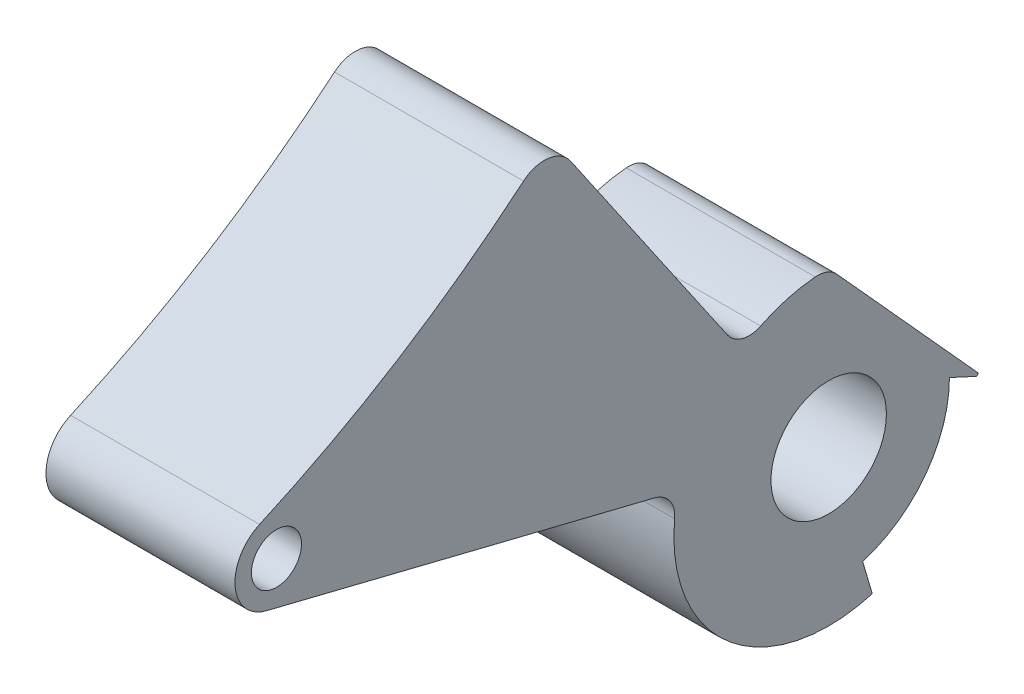
ISO-10303-21;
HEADER;
FILE_DESCRIPTION(('STEP AP214'),'2;1');
FILE_NAME('part.step','',(''),(''),'','','');
FILE_SCHEMA(('AUTOMOTIVE_DESIGN { 1 0 10303 214 1 1 1 1 }'));
ENDSEC;
DATA;
#1=APPLICATION_CONTEXT('core data for automotive mechanical design processes');
#2=APPLICATION_PROTOCOL_DEFINITION('international standard','automotive_design',2000,#1);
#3=PRODUCT_CONTEXT('',#1,'mechanical');
#4=PRODUCT('Part','Part','',(#3));
#5=PRODUCT_RELATED_PRODUCT_CATEGORY('part','',(#4));
#6=PRODUCT_DEFINITION_FORMATION('','',#4);
#7=PRODUCT_DEFINITION_CONTEXT('part definition',#1,'design');
#8=PRODUCT_DEFINITION('design','',#6,#7);
#9=PRODUCT_DEFINITION_SHAPE('','',#8);
#10=(LENGTH_UNIT() NAMED_UNIT(*) SI_UNIT(.MILLI.,.METRE.));
#11=(NAMED_UNIT(*) PLANE_ANGLE_UNIT() SI_UNIT($,.RADIAN.));
#12=(NAMED_UNIT(*) SI_UNIT($,.STERADIAN.) SOLID_ANGLE_UNIT());
#13=UNCERTAINTY_MEASURE_WITH_UNIT(LENGTH_MEASURE(1.E-05),#10,'distance_accuracy_value','');
#14=(GEOMETRIC_REPRESENTATION_CONTEXT(3) GLOBAL_UNCERTAINTY_ASSIGNED_CONTEXT((#13)) GLOBAL_UNIT_ASSIGNED_CONTEXT((#10,
#11,#12)) REPRESENTATION_CONTEXT('',''));
#15=CARTESIAN_POINT('',(0.,0.,0.));
#16=DIRECTION('',(0.,0.,1.));
#17=DIRECTION('',(1.,0.,0.));
#18=AXIS2_PLACEMENT_3D('',#15,#16,#17);
#19=CARTESIAN_POINT('',(9.144,59.6437300638257,49.4078256887024));
#20=DIRECTION('',(-1.,0.,0.));
#21=DIRECTION('',(0.,0.,1.));
#22=AXIS2_PLACEMENT_3D('',#19,#20,#21);
#23=CYLINDRICAL_SURFACE('',#22,53.7538724969782);
#24=CARTESIAN_POINT('',(0.,59.6437300638257,49.4078256887024));
#25=DIRECTION('',(1.,0.,0.));
#26=DIRECTION('',(0.,0.,-1.));
#27=AXIS2_PLACEMENT_3D('',#24,#25,#26);
#28=CIRCLE('',#27,53.7538724969782);
#29=CARTESIAN_POINT('',(0.,10.5384242082329,27.5412359854573));
#30=VERTEX_POINT('',#29);
#31=CARTESIAN_POINT('',(0.,18.5388393420938,14.7687326408775));
#32=VERTEX_POINT('',#31);
#33=EDGE_CURVE('E145',#30,#32,#28,.T.);
#34=ORIENTED_EDGE('',*,*,#33,.F.);
#35=DIRECTION('',(-1.,0.,0.));
#36=VECTOR('',#35,1.);
#37=CARTESIAN_POINT('',(9.144,10.5384242082329,27.5412359854573));
#38=LINE('',#37,#36);
#39=CARTESIAN_POINT('',(9.144,10.5384242082329,27.5412359854573));
#40=VERTEX_POINT('',#39);
#41=EDGE_CURVE('E141',#40,#30,#38,.T.);
#42=ORIENTED_EDGE('',*,*,#41,.F.);
#43=CARTESIAN_POINT('',(9.144,59.6437300638257,49.4078256887024));
#44=DIRECTION('',(1.,0.,0.));
#45=DIRECTION('',(0.,0.,-1.));
#46=AXIS2_PLACEMENT_3D('',#43,#44,#45);
#47=CIRCLE('',#46,53.7538724969782);
#48=CARTESIAN_POINT('',(9.144,18.5388393420938,14.7687326408775));
#49=VERTEX_POINT('',#48);
#50=EDGE_CURVE('E143',#40,#49,#47,.T.);
#51=ORIENTED_EDGE('',*,*,#50,.T.);
#52=DIRECTION('',(-1.,0.,0.));
#53=VECTOR('',#52,1.);
#54=CARTESIAN_POINT('',(9.144,18.5388393420938,14.7687326408775));
#55=LINE('',#54,#53);
#56=EDGE_CURVE('E190',#49,#32,#55,.T.);
#57=ORIENTED_EDGE('',*,*,#56,.T.);
#58=EDGE_LOOP('',(#34,#42,#51,#57));
#59=FACE_BOUND('',#58,.T.);
#60=ADVANCED_FACE('F34',(#59),#23,.F.);
#61=CARTESIAN_POINT('',(9.144,8.7022656556347,26.7235946939466));
#62=DIRECTION('',(-1.,0.,0.));
#63=DIRECTION('',(0.,0.,1.));
#64=AXIS2_PLACEMENT_3D('',#61,#62,#63);
#65=CYLINDRICAL_SURFACE('',#64,2.00997898294054);
#66=CARTESIAN_POINT('',(0.,8.7022656556347,26.7235946939466));
#67=DIRECTION('',(1.,0.,0.));
#68=DIRECTION('',(0.,0.,-1.));
#69=AXIS2_PLACEMENT_3D('',#66,#67,#68);
#70=CIRCLE('',#69,2.00997898294054);
#71=CARTESIAN_POINT('',(0.,6.75145114588074,27.2076796662356));
#72=VERTEX_POINT('',#71);
#73=EDGE_CURVE('E195',#72,#30,#70,.F.);
#74=ORIENTED_EDGE('',*,*,#73,.F.);
#75=DIRECTION('',(-1.,0.,0.));
#76=VECTOR('',#75,1.);
#77=CARTESIAN_POINT('',(9.144,6.75145114588074,27.2076796662356));
#78=LINE('',#77,#76);
#79=CARTESIAN_POINT('',(9.144,6.75145114588074,27.2076796662356));
#80=VERTEX_POINT('',#79);
#81=EDGE_CURVE('E151',#80,#72,#78,.T.);
#82=ORIENTED_EDGE('',*,*,#81,.F.);
#83=CARTESIAN_POINT('',(9.144,8.7022656556347,26.7235946939466));
#84=DIRECTION('',(1.,0.,0.));
#85=DIRECTION('',(0.,0.,-1.));
#86=AXIS2_PLACEMENT_3D('',#83,#84,#85);
#87=CIRCLE('',#86,2.00997898294054);
#88=EDGE_CURVE('E158',#80,#40,#87,.F.);
#89=ORIENTED_EDGE('',*,*,#88,.T.);
#90=ORIENTED_EDGE('',*,*,#41,.T.);
#91=EDGE_LOOP('',(#74,#82,#89,#90));
#92=FACE_BOUND('',#91,.T.);
#93=ADVANCED_FACE('F164',(#92),#65,.T.);
#94=CARTESIAN_POINT('',(9.144,0.,0.));
#95=DIRECTION('',(0.,0.970564630929612,-0.240840812962558));
#96=DIRECTION('',(0.,0.240840812962558,0.970564630929612));
#97=AXIS2_PLACEMENT_3D('',#94,#95,#96);
#98=PLANE('',#97);
#99=DIRECTION('',(0.,-0.240840812962558,-0.970564630929612));
#100=VECTOR('',#99,1.);
#101=CARTESIAN_POINT('',(0.,0.,0.));
#102=LINE('',#101,#100);
#103=CARTESIAN_POINT('',(0.,2.08820608487123,8.41526377168932));
#104=VERTEX_POINT('',#103);
#105=EDGE_CURVE('E197',#72,#104,#102,.T.);
#106=ORIENTED_EDGE('',*,*,#105,.T.);
#107=DIRECTION('',(1.,0.,0.));
#108=VECTOR('',#107,1.);
#109=CARTESIAN_POINT('',(9.144,2.08820608487123,8.41526377168932));
#110=LINE('',#109,#108);
#111=CARTESIAN_POINT('',(9.144,2.08820608487123,8.41526377168932));
#112=VERTEX_POINT('',#111);
#113=EDGE_CURVE('E49',#104,#112,#110,.T.);
#114=ORIENTED_EDGE('',*,*,#113,.T.);
#115=DIRECTION('',(0.,-0.240840812962558,-0.970564630929612));
#116=VECTOR('',#115,1.);
#117=CARTESIAN_POINT('',(9.144,0.,0.));
#118=LINE('',#117,#116);
#119=EDGE_CURVE('E165',#80,#112,#118,.T.);
#120=ORIENTED_EDGE('',*,*,#119,.F.);
#121=ORIENTED_EDGE('',*,*,#81,.T.);
#122=EDGE_LOOP('',(#106,#114,#120,#121));
#123=FACE_BOUND('',#122,.T.);
#124=ADVANCED_FACE('F295',(#123),#98,.F.);
#125=CARTESIAN_POINT('',(9.144,0.,0.));
#126=DIRECTION('',(-1.,0.,0.));
#127=DIRECTION('',(0.,0.,1.));
#128=AXIS2_PLACEMENT_3D('',#125,#126,#127);
#129=CYLINDRICAL_SURFACE('',#128,7.493);
#130=CARTESIAN_POINT('',(9.144,0.,0.));
#131=DIRECTION('',(1.,0.,0.));
#132=DIRECTION('',(0.,0.,-1.));
#133=AXIS2_PLACEMENT_3D('',#130,#131,#132);
#134=CIRCLE('',#133,7.493);
#135=CARTESIAN_POINT('',(9.144,0.731590597273144,7.45719948760803));
#136=VERTEX_POINT('',#135);
#137=CARTESIAN_POINT('',(9.144,-7.19071952423731,-2.10679892817335));
#138=VERTEX_POINT('',#137);
#139=EDGE_CURVE('E167',#136,#138,#134,.T.);
#140=ORIENTED_EDGE('',*,*,#139,.F.);
#141=DIRECTION('',(-1.,0.,0.));
#142=VECTOR('',#141,1.);
#143=CARTESIAN_POINT('',(9.144,0.731590597273144,7.45719948760803));
#144=LINE('',#143,#142);
#145=CARTESIAN_POINT('',(0.,0.731590597273144,7.45719948760803));
#146=VERTEX_POINT('',#145);
#147=EDGE_CURVE('E263',#136,#146,#144,.T.);
#148=ORIENTED_EDGE('',*,*,#147,.T.);
#149=CARTESIAN_POINT('',(0.,0.,0.));
#150=DIRECTION('',(1.,0.,0.));
#151=DIRECTION('',(0.,0.,-1.));
#152=AXIS2_PLACEMENT_3D('',#149,#150,#151);
#153=CIRCLE('',#152,7.493);
#154=CARTESIAN_POINT('',(0.,-7.19071952423731,-2.10679892817335));
#155=VERTEX_POINT('',#154);
#156=EDGE_CURVE('E199',#146,#155,#153,.T.);
#157=ORIENTED_EDGE('',*,*,#156,.T.);
#158=DIRECTION('',(-1.,0.,0.));
#159=VECTOR('',#158,1.);
#160=CARTESIAN_POINT('',(9.144,-7.19071952423731,-2.10679892817335));
#161=LINE('',#160,#159);
#162=EDGE_CURVE('E231',#138,#155,#161,.T.);
#163=ORIENTED_EDGE('',*,*,#162,.F.);
#164=EDGE_LOOP('',(#140,#148,#157,#163));
#165=FACE_BOUND('',#164,.T.);
#166=ADVANCED_FACE('F269',(#165),#129,.T.);
#167=CARTESIAN_POINT('',(9.144,0.,0.));
#168=DIRECTION('',(0.,0.281168948108014,-0.959658284296985));
#169=DIRECTION('',(0.,0.959658284296985,0.281168948108014));
#170=AXIS2_PLACEMENT_3D('',#167,#168,#169);
#171=PLANE('',#170);
#172=DIRECTION('',(0.,-0.959658284296985,-0.281168948108014));
#173=VECTOR('',#172,1.);
#174=CARTESIAN_POINT('',(0.,0.,0.));
#175=LINE('',#174,#173);
#176=CARTESIAN_POINT('',(0.,-5.60632369686299,-1.64258899484702));
#177=VERTEX_POINT('',#176);
#178=EDGE_CURVE('E201',#177,#155,#175,.T.);
#179=ORIENTED_EDGE('',*,*,#178,.F.);
#180=DIRECTION('',(-1.,0.,0.));
#181=VECTOR('',#180,1.);
#182=CARTESIAN_POINT('',(9.144,-5.60632369686299,-1.64258899484702));
#183=LINE('',#182,#181);
#184=CARTESIAN_POINT('',(9.144,-5.60632369686299,-1.64258899484702));
#185=VERTEX_POINT('',#184);
#186=EDGE_CURVE('E229',#185,#177,#183,.T.);
#187=ORIENTED_EDGE('',*,*,#186,.F.);
#188=DIRECTION('',(0.,-0.959658284296985,-0.281168948108014));
#189=VECTOR('',#188,1.);
#190=CARTESIAN_POINT('',(9.144,0.,0.));
#191=LINE('',#190,#189);
#192=EDGE_CURVE('E172',#185,#138,#191,.T.);
#193=ORIENTED_EDGE('',*,*,#192,.T.);
#194=ORIENTED_EDGE('',*,*,#162,.T.);
#195=EDGE_LOOP('',(#179,#187,#193,#194));
#196=FACE_BOUND('',#195,.T.);
#197=ADVANCED_FACE('F279',(#196),#171,.T.);
#198=CARTESIAN_POINT('',(9.144,0.,0.));
#199=DIRECTION('',(-1.,0.,0.));
#200=DIRECTION('',(0.,0.,1.));
#201=AXIS2_PLACEMENT_3D('',#198,#199,#200);
#202=CYLINDRICAL_SURFACE('',#201,5.842);
#203=CARTESIAN_POINT('',(0.,0.,0.));
#204=DIRECTION('',(1.,0.,0.));
#205=DIRECTION('',(0.,0.,-1.));
#206=AXIS2_PLACEMENT_3D('',#203,#204,#205);
#207=CIRCLE('',#206,5.842);
#208=CARTESIAN_POINT('',(0.,0.,-5.842));
#209=VERTEX_POINT('',#208);
#210=EDGE_CURVE('E205',#177,#209,#207,.T.);
#211=ORIENTED_EDGE('',*,*,#210,.T.);
#212=DIRECTION('',(-1.,0.,0.));
#213=VECTOR('',#212,1.);
#214=CARTESIAN_POINT('',(9.144,0.,-5.842));
#215=LINE('',#214,#213);
#216=CARTESIAN_POINT('',(9.144,0.,-5.842));
#217=VERTEX_POINT('',#216);
#218=EDGE_CURVE('E226',#217,#209,#215,.T.);
#219=ORIENTED_EDGE('',*,*,#218,.F.);
#220=CARTESIAN_POINT('',(9.144,0.,0.));
#221=DIRECTION('',(1.,0.,0.));
#222=DIRECTION('',(0.,0.,-1.));
#223=AXIS2_PLACEMENT_3D('',#220,#221,#222);
#224=CIRCLE('',#223,5.842);
#225=EDGE_CURVE('E176',#185,#217,#224,.T.);
#226=ORIENTED_EDGE('',*,*,#225,.F.);
#227=ORIENTED_EDGE('',*,*,#186,.T.);
#228=EDGE_LOOP('',(#211,#219,#226,#227));
#229=FACE_BOUND('',#228,.T.);
#230=ADVANCED_FACE('F333',(#229),#202,.T.);
#231=CARTESIAN_POINT('',(9.144,2.22597558552621,-1.02963179347826));
#232=DIRECTION('',(0.,0.907608695652174,-0.419817169225557));
#233=DIRECTION('',(0.,0.419817169225557,0.907608695652174));
#234=AXIS2_PLACEMENT_3D('',#231,#232,#233);
#235=PLANE('',#234);
#236=DIRECTION('',(0.,-0.419817169225557,-0.907608695652174));
#237=VECTOR('',#236,1.);
#238=CARTESIAN_POINT('',(0.,2.22597558552621,-1.02963179347826));
#239=LINE('',#238,#237);
#240=CARTESIAN_POINT('',(0.,-0.589447889841712,-7.1163357577325));
#241=VERTEX_POINT('',#240);
#242=EDGE_CURVE('E208',#209,#241,#239,.T.);
#243=ORIENTED_EDGE('',*,*,#242,.T.);
#244=DIRECTION('',(-1.,0.,0.));
#245=VECTOR('',#244,1.);
#246=CARTESIAN_POINT('',(9.144,-0.589447889841711,-7.1163357577325));
#247=LINE('',#246,#245);
#248=CARTESIAN_POINT('',(9.144,-0.589447889841712,-7.1163357577325));
#249=VERTEX_POINT('',#248);
#250=EDGE_CURVE('E239',#241,#249,#247,.F.);
#251=ORIENTED_EDGE('',*,*,#250,.T.);
#252=DIRECTION('',(0.,-0.419817169225557,-0.907608695652174));
#253=VECTOR('',#252,1.);
#254=CARTESIAN_POINT('',(9.144,2.22597558552621,-1.02963179347826));
#255=LINE('',#254,#253);
#256=EDGE_CURVE('E179',#217,#249,#255,.T.);
#257=ORIENTED_EDGE('',*,*,#256,.F.);
#258=ORIENTED_EDGE('',*,*,#218,.T.);
#259=EDGE_LOOP('',(#243,#251,#257,#258));
#260=FACE_BOUND('',#259,.T.);
#261=ADVANCED_FACE('F336',(#260),#235,.F.);
#262=CARTESIAN_POINT('',(9.144,3.37328253655848,-3.72786413043478));
#263=DIRECTION('',(0.,-0.670962877745276,0.741490941743578));
#264=DIRECTION('',(0.,-0.741490941743578,-0.670962877745276));
#265=AXIS2_PLACEMENT_3D('',#262,#263,#264);
#266=PLANE('',#265);
#267=DIRECTION('',(0.,0.741490941743578,0.670962877745276));
#268=VECTOR('',#267,1.);
#269=CARTESIAN_POINT('',(0.,3.37328253655848,-3.72786413043478));
#270=LINE('',#269,#268);
#271=CARTESIAN_POINT('',(0.,-0.469160735948826,-7.20482743578835));
#272=VERTEX_POINT('',#271);
#273=CARTESIAN_POINT('',(0.,7.05146149261197,-0.39954088563212));
#274=VERTEX_POINT('',#273);
#275=EDGE_CURVE('E211',#272,#274,#270,.T.);
#276=ORIENTED_EDGE('',*,*,#275,.T.);
#277=DIRECTION('',(-1.,0.,0.));
#278=VECTOR('',#277,1.);
#279=CARTESIAN_POINT('',(9.144,7.05146149261197,-0.39954088563212));
#280=LINE('',#279,#278);
#281=CARTESIAN_POINT('',(9.144,7.05146149261197,-0.39954088563212));
#282=VERTEX_POINT('',#281);
#283=EDGE_CURVE('E259',#274,#282,#280,.F.);
#284=ORIENTED_EDGE('',*,*,#283,.T.);
#285=DIRECTION('',(0.,0.741490941743578,0.670962877745276));
#286=VECTOR('',#285,1.);
#287=CARTESIAN_POINT('',(9.144,3.37328253655848,-3.72786413043478));
#288=LINE('',#287,#286);
#289=CARTESIAN_POINT('',(9.144,-0.469160735948826,-7.20482743578835));
#290=VERTEX_POINT('',#289);
#291=EDGE_CURVE('E182',#290,#282,#288,.T.);
#292=ORIENTED_EDGE('',*,*,#291,.F.);
#293=DIRECTION('',(-1.,0.,0.));
#294=VECTOR('',#293,1.);
#295=CARTESIAN_POINT('',(9.144,-0.469160735948825,-7.20482743578835));
#296=LINE('',#295,#294);
#297=EDGE_CURVE('E150',#290,#272,#296,.T.);
#298=ORIENTED_EDGE('',*,*,#297,.T.);
#299=EDGE_LOOP('',(#276,#284,#292,#298));
#300=FACE_BOUND('',#299,.T.);
#301=ADVANCED_FACE('F340',(#300),#266,.F.);
#302=CARTESIAN_POINT('',(9.144,7.4645097884623,0.652796000256147));
#303=VERTEX_POINT('',#302);
#304=CARTESIAN_POINT('',(9.144,6.7305187219526,3.29320007491885));
#305=VERTEX_POINT('',#304);
#306=EDGE_CURVE('E173',#303,#305,#134,.T.);
#307=ORIENTED_EDGE('',*,*,#306,.F.);
#308=DIRECTION('',(-1.,0.,0.));
#309=VECTOR('',#308,1.);
#310=CARTESIAN_POINT('',(9.144,7.46450978846231,0.652796000256147));
#311=LINE('',#310,#309);
#312=CARTESIAN_POINT('',(0.,7.4645097884623,0.652796000256147));
#313=VERTEX_POINT('',#312);
#314=EDGE_CURVE('E254',#303,#313,#311,.T.);
#315=ORIENTED_EDGE('',*,*,#314,.T.);
#316=CARTESIAN_POINT('',(0.,6.7305187219526,3.29320007491885));
#317=VERTEX_POINT('',#316);
#318=EDGE_CURVE('E202',#313,#317,#153,.T.);
#319=ORIENTED_EDGE('',*,*,#318,.T.);
#320=DIRECTION('',(-1.,0.,0.));
#321=VECTOR('',#320,1.);
#322=CARTESIAN_POINT('',(9.144,6.7305187219526,3.29320007491885));
#323=LINE('',#322,#321);
#324=EDGE_CURVE('E246',#317,#305,#323,.F.);
#325=ORIENTED_EDGE('',*,*,#324,.T.);
#326=EDGE_LOOP('',(#307,#315,#319,#325));
#327=FACE_BOUND('',#326,.T.);
#328=ADVANCED_FACE('F329',(#327),#129,.T.);
#329=CARTESIAN_POINT('',(9.144,0.,0.));
#330=DIRECTION('',(0.,-0.565043221617924,0.825061305421384));
#331=DIRECTION('',(0.,-0.825061305421384,-0.565043221617924));
#332=AXIS2_PLACEMENT_3D('',#329,#330,#331);
#333=PLANE('',#332);
#334=DIRECTION('',(0.,0.825061305421384,0.565043221617924));
#335=VECTOR('',#334,1.);
#336=CARTESIAN_POINT('',(9.144,0.,0.));
#337=LINE('',#336,#335);
#338=CARTESIAN_POINT('',(9.144,7.15367971557455,4.89919743702754));
#339=VERTEX_POINT('',#338);
#340=CARTESIAN_POINT('',(9.144,18.2283927662315,12.4837144899043));
#341=VERTEX_POINT('',#340);
#342=EDGE_CURVE('E184',#339,#341,#337,.T.);
#343=ORIENTED_EDGE('',*,*,#342,.F.);
#344=DIRECTION('',(1.,0.,0.));
#345=VECTOR('',#344,1.);
#346=CARTESIAN_POINT('',(0.,7.15367971557455,4.89919743702754));
#347=LINE('',#346,#345);
#348=CARTESIAN_POINT('',(0.,7.15367971557455,4.89919743702754));
#349=VERTEX_POINT('',#348);
#350=EDGE_CURVE('E243',#339,#349,#347,.F.);
#351=ORIENTED_EDGE('',*,*,#350,.T.);
#352=DIRECTION('',(0.,0.825061305421384,0.565043221617924));
#353=VECTOR('',#352,1.);
#354=CARTESIAN_POINT('',(0.,0.,0.));
#355=LINE('',#354,#353);
#356=CARTESIAN_POINT('',(0.,18.2283927662315,12.4837144899043));
#357=VERTEX_POINT('',#356);
#358=EDGE_CURVE('E214',#349,#357,#355,.T.);
#359=ORIENTED_EDGE('',*,*,#358,.T.);
#360=DIRECTION('',(-1.,0.,0.));
#361=VECTOR('',#360,1.);
#362=CARTESIAN_POINT('',(9.144,18.2283927662315,12.4837144899043));
#363=LINE('',#362,#361);
#364=EDGE_CURVE('E223',#341,#357,#363,.T.);
#365=ORIENTED_EDGE('',*,*,#364,.F.);
#366=EDGE_LOOP('',(#343,#351,#359,#365));
#367=FACE_BOUND('',#366,.T.);
#368=ADVANCED_FACE('F320',(#367),#333,.F.);
#369=CARTESIAN_POINT('',(9.144,17.3497494040662,13.7666865027571));
#370=DIRECTION('',(-1.,0.,0.));
#371=DIRECTION('',(0.,0.,1.));
#372=AXIS2_PLACEMENT_3D('',#369,#370,#371);
#373=CYLINDRICAL_SURFACE('',#372,1.55500203975452);
#374=CARTESIAN_POINT('',(0.,17.3497494040662,13.7666865027571));
#375=DIRECTION('',(1.,0.,0.));
#376=DIRECTION('',(0.,0.,-1.));
#377=AXIS2_PLACEMENT_3D('',#374,#375,#376);
#378=CIRCLE('',#377,1.55500203975452);
#379=EDGE_CURVE('E216',#357,#32,#378,.T.);
#380=ORIENTED_EDGE('',*,*,#379,.T.);
#381=ORIENTED_EDGE('',*,*,#56,.F.);
#382=CARTESIAN_POINT('',(9.144,17.3497494040662,13.7666865027571));
#383=DIRECTION('',(1.,0.,0.));
#384=DIRECTION('',(0.,0.,-1.));
#385=AXIS2_PLACEMENT_3D('',#382,#383,#384);
#386=CIRCLE('',#385,1.55500203975452);
#387=EDGE_CURVE('E160',#341,#49,#386,.T.);
#388=ORIENTED_EDGE('',*,*,#387,.F.);
#389=ORIENTED_EDGE('',*,*,#364,.T.);
#390=EDGE_LOOP('',(#380,#381,#388,#389));
#391=FACE_BOUND('',#390,.T.);
#392=ADVANCED_FACE('F303',(#391),#373,.T.);
#393=CARTESIAN_POINT('',(9.144,8.7022656556347,26.7235946939466));
#394=DIRECTION('',(-1.,0.,0.));
#395=DIRECTION('',(0.,0.,1.));
#396=AXIS2_PLACEMENT_3D('',#393,#394,#395);
#397=CYLINDRICAL_SURFACE('',#396,1.21248646484585);
#398=CARTESIAN_POINT('',(9.144,8.7022656556347,26.7235946939466));
#399=DIRECTION('',(1.,0.,0.));
#400=DIRECTION('',(0.,0.,-1.));
#401=AXIS2_PLACEMENT_3D('',#398,#399,#400);
#402=CIRCLE('',#401,1.21248646484585);
#403=CARTESIAN_POINT('',(9.144,8.7022656556347,25.5111082291007));
#404=VERTEX_POINT('',#403);
#405=EDGE_CURVE('E162',#404,#404,#402,.T.);
#406=ORIENTED_EDGE('',*,*,#405,.T.);
#407=EDGE_LOOP('',(#406));
#408=FACE_BOUND('',#407,.T.);
#409=CARTESIAN_POINT('',(0.,8.7022656556347,26.7235946939466));
#410=DIRECTION('',(1.,0.,0.));
#411=DIRECTION('',(0.,0.,-1.));
#412=AXIS2_PLACEMENT_3D('',#409,#410,#411);
#413=CIRCLE('',#412,1.21248646484585);
#414=CARTESIAN_POINT('',(0.,8.7022656556347,25.5111082291007));
#415=VERTEX_POINT('',#414);
#416=EDGE_CURVE('E191',#415,#415,#413,.T.);
#417=ORIENTED_EDGE('',*,*,#416,.F.);
#418=EDGE_LOOP('',(#417));
#419=FACE_BOUND('',#418,.T.);
#420=ADVANCED_FACE('F299',(#408,#419),#397,.F.);
#421=CARTESIAN_POINT('',(9.144,0.,0.));
#422=DIRECTION('',(-1.,0.,0.));
#423=DIRECTION('',(0.,0.,1.));
#424=AXIS2_PLACEMENT_3D('',#421,#422,#423);
#425=CYLINDRICAL_SURFACE('',#424,2.794);
#426=CARTESIAN_POINT('',(9.144,0.,0.));
#427=DIRECTION('',(1.,0.,0.));
#428=DIRECTION('',(0.,0.,-1.));
#429=AXIS2_PLACEMENT_3D('',#426,#427,#428);
#430=CIRCLE('',#429,2.794);
#431=CARTESIAN_POINT('',(9.144,0.,-2.794));
#432=VERTEX_POINT('',#431);
#433=EDGE_CURVE('E187',#432,#432,#430,.T.);
#434=ORIENTED_EDGE('',*,*,#433,.T.);
#435=EDGE_LOOP('',(#434));
#436=FACE_BOUND('',#435,.T.);
#437=CARTESIAN_POINT('',(0.,0.,0.));
#438=DIRECTION('',(1.,0.,0.));
#439=DIRECTION('',(0.,0.,-1.));
#440=AXIS2_PLACEMENT_3D('',#437,#438,#439);
#441=CIRCLE('',#440,2.794);
#442=CARTESIAN_POINT('',(0.,0.,-2.794));
#443=VERTEX_POINT('',#442);
#444=EDGE_CURVE('E219',#443,#443,#441,.T.);
#445=ORIENTED_EDGE('',*,*,#444,.F.);
#446=EDGE_LOOP('',(#445));
#447=FACE_BOUND('',#446,.T.);
#448=ADVANCED_FACE('F302',(#436,#447),#425,.F.);
#449=CARTESIAN_POINT('',(9.144,0.,0.));
#450=DIRECTION('',(1.,0.,0.));
#451=DIRECTION('',(0.,0.,-1.));
#452=AXIS2_PLACEMENT_3D('',#449,#450,#451);
#453=PLANE('',#452);
#454=ORIENTED_EDGE('',*,*,#405,.F.);
#455=EDGE_LOOP('',(#454));
#456=FACE_BOUND('',#455,.T.);
#457=ORIENTED_EDGE('',*,*,#291,.T.);
#458=CARTESIAN_POINT('',(9.144,6.19933863787547,0.542152610382224));
#459=DIRECTION('',(1.,0.,0.));
#460=DIRECTION('',(0.,0.,-1.));
#461=AXIS2_PLACEMENT_3D('',#458,#459,#460);
#462=CIRCLE('',#461,1.27);
#463=EDGE_CURVE('E261',#282,#303,#462,.T.);
#464=ORIENTED_EDGE('',*,*,#463,.T.);
#465=ORIENTED_EDGE('',*,*,#306,.T.);
#466=CARTESIAN_POINT('',(9.144,7.87128460702931,3.85136957914238));
#467=DIRECTION('',(1.,0.,0.));
#468=DIRECTION('',(0.,0.,-1.));
#469=AXIS2_PLACEMENT_3D('',#466,#467,#468);
#470=CIRCLE('',#469,1.27);
#471=EDGE_CURVE('E252',#305,#339,#470,.F.);
#472=ORIENTED_EDGE('',*,*,#471,.T.);
#473=ORIENTED_EDGE('',*,*,#342,.T.);
#474=ORIENTED_EDGE('',*,*,#387,.T.);
#475=ORIENTED_EDGE('',*,*,#50,.F.);
#476=ORIENTED_EDGE('',*,*,#88,.F.);
#477=ORIENTED_EDGE('',*,*,#119,.T.);
#478=CARTESIAN_POINT('',(9.144,0.855589003590626,8.72113160415177));
#479=DIRECTION('',(1.,0.,0.));
#480=DIRECTION('',(0.,0.,-1.));
#481=AXIS2_PLACEMENT_3D('',#478,#479,#480);
#482=CIRCLE('',#481,1.27);
#483=EDGE_CURVE('E11',#112,#136,#482,.F.);
#484=ORIENTED_EDGE('',*,*,#483,.T.);
#485=ORIENTED_EDGE('',*,*,#139,.T.);
#486=ORIENTED_EDGE('',*,*,#192,.F.);
#487=ORIENTED_EDGE('',*,*,#225,.T.);
#488=ORIENTED_EDGE('',*,*,#256,.T.);
#489=CARTESIAN_POINT('',(9.144,-0.520288107233016,-7.14832582602748));
#490=DIRECTION('',(1.,0.,0.));
#491=DIRECTION('',(0.,0.,-1.));
#492=AXIS2_PLACEMENT_3D('',#489,#490,#491);
#493=CIRCLE('',#492,0.0762);
#494=EDGE_CURVE('E241',#249,#290,#493,.T.);
#495=ORIENTED_EDGE('',*,*,#494,.T.);
#496=EDGE_LOOP('',(#457,#464,#465,#472,#473,#474,#475,#476,#477,#484,#485,#486,#487,#488,#495));
#497=FACE_BOUND('',#496,.T.);
#498=ORIENTED_EDGE('',*,*,#433,.F.);
#499=EDGE_LOOP('',(#498));
#500=FACE_BOUND('',#499,.T.);
#501=ADVANCED_FACE('F156',(#456,#497,#500),#453,.T.);
#502=CARTESIAN_POINT('',(0.,0.,0.));
#503=DIRECTION('',(1.,0.,0.));
#504=DIRECTION('',(0.,0.,-1.));
#505=AXIS2_PLACEMENT_3D('',#502,#503,#504);
#506=PLANE('',#505);
#507=ORIENTED_EDGE('',*,*,#416,.T.);
#508=EDGE_LOOP('',(#507));
#509=FACE_BOUND('',#508,.T.);
#510=ORIENTED_EDGE('',*,*,#318,.F.);
#511=CARTESIAN_POINT('',(0.,6.19933863787547,0.542152610382224));
#512=DIRECTION('',(1.,0.,0.));
#513=DIRECTION('',(0.,0.,-1.));
#514=AXIS2_PLACEMENT_3D('',#511,#512,#513);
#515=CIRCLE('',#514,1.27);
#516=EDGE_CURVE('E257',#313,#274,#515,.F.);
#517=ORIENTED_EDGE('',*,*,#516,.T.);
#518=ORIENTED_EDGE('',*,*,#275,.F.);
#519=CARTESIAN_POINT('',(0.,-0.520288107233016,-7.14832582602748));
#520=DIRECTION('',(1.,0.,0.));
#521=DIRECTION('',(0.,0.,-1.));
#522=AXIS2_PLACEMENT_3D('',#519,#520,#521);
#523=CIRCLE('',#522,0.0762);
#524=EDGE_CURVE('E237',#272,#241,#523,.F.);
#525=ORIENTED_EDGE('',*,*,#524,.T.);
#526=ORIENTED_EDGE('',*,*,#242,.F.);
#527=ORIENTED_EDGE('',*,*,#210,.F.);
#528=ORIENTED_EDGE('',*,*,#178,.T.);
#529=ORIENTED_EDGE('',*,*,#156,.F.);
#530=CARTESIAN_POINT('',(0.,0.855589003590626,8.72113160415177));
#531=DIRECTION('',(1.,0.,0.));
#532=DIRECTION('',(0.,0.,-1.));
#533=AXIS2_PLACEMENT_3D('',#530,#531,#532);
#534=CIRCLE('',#533,1.27);
#535=EDGE_CURVE('E42',#146,#104,#534,.T.);
#536=ORIENTED_EDGE('',*,*,#535,.T.);
#537=ORIENTED_EDGE('',*,*,#105,.F.);
#538=ORIENTED_EDGE('',*,*,#73,.T.);
#539=ORIENTED_EDGE('',*,*,#33,.T.);
#540=ORIENTED_EDGE('',*,*,#379,.F.);
#541=ORIENTED_EDGE('',*,*,#358,.F.);
#542=CARTESIAN_POINT('',(0.,7.87128460702931,3.85136957914238));
#543=DIRECTION('',(1.,0.,0.));
#544=DIRECTION('',(0.,0.,-1.));
#545=AXIS2_PLACEMENT_3D('',#542,#543,#544);
#546=CIRCLE('',#545,1.27);
#547=EDGE_CURVE('E249',#349,#317,#546,.T.);
#548=ORIENTED_EDGE('',*,*,#547,.T.);
#549=EDGE_LOOP('',(#510,#517,#518,#525,#526,#527,#528,#529,#536,#537,#538,#539,#540,#541,#548));
#550=FACE_BOUND('',#549,.T.);
#551=ORIENTED_EDGE('',*,*,#444,.T.);
#552=EDGE_LOOP('',(#551));
#553=FACE_BOUND('',#552,.T.);
#554=ADVANCED_FACE('F274',(#509,#550,#553),#506,.F.);
#555=CARTESIAN_POINT('',(9.144,-0.520288107233016,-7.14832582602748));
#556=DIRECTION('',(-1.,0.,0.));
#557=DIRECTION('',(0.,0.,1.));
#558=AXIS2_PLACEMENT_3D('',#555,#556,#557);
#559=CYLINDRICAL_SURFACE('',#558,0.0762);
#560=ORIENTED_EDGE('',*,*,#494,.F.);
#561=ORIENTED_EDGE('',*,*,#250,.F.);
#562=ORIENTED_EDGE('',*,*,#524,.F.);
#563=ORIENTED_EDGE('',*,*,#297,.F.);
#564=EDGE_LOOP('',(#560,#561,#562,#563));
#565=FACE_BOUND('',#564,.T.);
#566=ADVANCED_FACE('F305',(#565),#559,.T.);
#567=CARTESIAN_POINT('',(9.144,7.87128460702931,3.85136957914238));
#568=DIRECTION('',(-1.,0.,0.));
#569=DIRECTION('',(0.,0.,1.));
#570=AXIS2_PLACEMENT_3D('',#567,#568,#569);
#571=CYLINDRICAL_SURFACE('',#570,1.27);
#572=ORIENTED_EDGE('',*,*,#471,.F.);
#573=ORIENTED_EDGE('',*,*,#324,.F.);
#574=ORIENTED_EDGE('',*,*,#547,.F.);
#575=ORIENTED_EDGE('',*,*,#350,.F.);
#576=EDGE_LOOP('',(#572,#573,#574,#575));
#577=FACE_BOUND('',#576,.T.);
#578=ADVANCED_FACE('F288',(#577),#571,.F.);
#579=CARTESIAN_POINT('',(9.144,6.19933863787547,0.542152610382224));
#580=DIRECTION('',(-1.,0.,0.));
#581=DIRECTION('',(0.,0.,1.));
#582=AXIS2_PLACEMENT_3D('',#579,#580,#581);
#583=CYLINDRICAL_SURFACE('',#582,1.27);
#584=ORIENTED_EDGE('',*,*,#463,.F.);
#585=ORIENTED_EDGE('',*,*,#283,.F.);
#586=ORIENTED_EDGE('',*,*,#516,.F.);
#587=ORIENTED_EDGE('',*,*,#314,.F.);
#588=EDGE_LOOP('',(#584,#585,#586,#587));
#589=FACE_BOUND('',#588,.T.);
#590=ADVANCED_FACE('F284',(#589),#583,.T.);
#591=CARTESIAN_POINT('',(9.144,0.855589003590626,8.72113160415177));
#592=DIRECTION('',(-1.,0.,0.));
#593=DIRECTION('',(0.,0.,1.));
#594=AXIS2_PLACEMENT_3D('',#591,#592,#593);
#595=CYLINDRICAL_SURFACE('',#594,1.27);
#596=ORIENTED_EDGE('',*,*,#483,.F.);
#597=ORIENTED_EDGE('',*,*,#113,.F.);
#598=ORIENTED_EDGE('',*,*,#535,.F.);
#599=ORIENTED_EDGE('',*,*,#147,.F.);
#600=EDGE_LOOP('',(#596,#597,#598,#599));
#601=FACE_BOUND('',#600,.T.);
#602=ADVANCED_FACE('F36',(#601),#595,.F.);
#603=CLOSED_SHELL('',(#60,#93,#124,#166,#197,#230,#261,#301,#328,#368,#392,#420,#448,#501,#554,
#566,#578,#590,#602));
#604=MANIFOLD_SOLID_BREP('B2',#603);
#605=ADVANCED_BREP_SHAPE_REPRESENTATION('',(#18,#604),#14);
#606=SHAPE_DEFINITION_REPRESENTATION(#9,#605);
ENDSEC;
END-ISO-10303-21;
